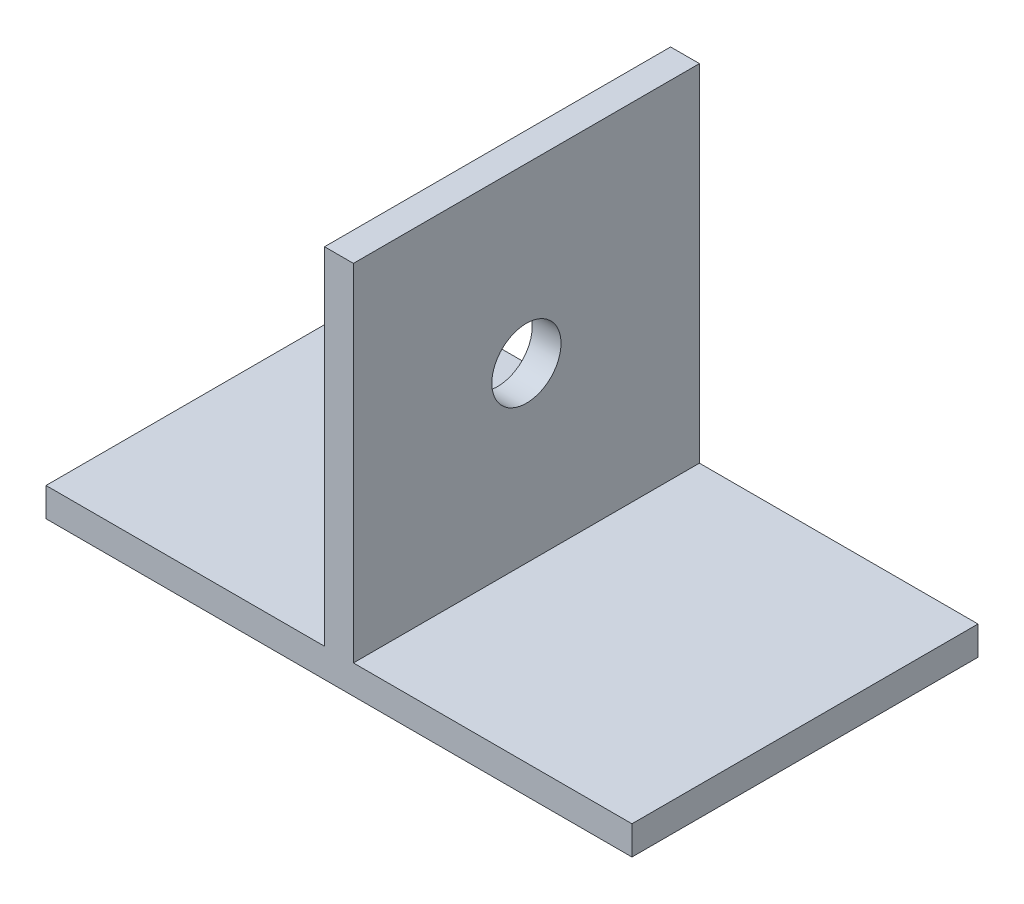
ISO-10303-21;
HEADER;
FILE_DESCRIPTION(('STEP AP214'),'2;1');
FILE_NAME('part.step','',(''),(''),'','','');
FILE_SCHEMA(('AUTOMOTIVE_DESIGN { 1 0 10303 214 1 1 1 1 }'));
ENDSEC;
DATA;
#1=APPLICATION_CONTEXT('core data for automotive mechanical design processes');
#2=APPLICATION_PROTOCOL_DEFINITION('international standard','automotive_design',2000,#1);
#3=PRODUCT_CONTEXT('',#1,'mechanical');
#4=PRODUCT('Part','Part','',(#3));
#5=PRODUCT_RELATED_PRODUCT_CATEGORY('part','',(#4));
#6=PRODUCT_DEFINITION_FORMATION('','',#4);
#7=PRODUCT_DEFINITION_CONTEXT('part definition',#1,'design');
#8=PRODUCT_DEFINITION('design','',#6,#7);
#9=PRODUCT_DEFINITION_SHAPE('','',#8);
#10=(LENGTH_UNIT() NAMED_UNIT(*) SI_UNIT(.MILLI.,.METRE.));
#11=(NAMED_UNIT(*) PLANE_ANGLE_UNIT() SI_UNIT($,.RADIAN.));
#12=(NAMED_UNIT(*) SI_UNIT($,.STERADIAN.) SOLID_ANGLE_UNIT());
#13=UNCERTAINTY_MEASURE_WITH_UNIT(LENGTH_MEASURE(1.E-05),#10,'distance_accuracy_value','');
#14=(GEOMETRIC_REPRESENTATION_CONTEXT(3) GLOBAL_UNCERTAINTY_ASSIGNED_CONTEXT((#13)) GLOBAL_UNIT_ASSIGNED_CONTEXT((#10,
#11,#12)) REPRESENTATION_CONTEXT('',''));
#15=CARTESIAN_POINT('',(0.,0.,0.));
#16=DIRECTION('',(0.,0.,1.));
#17=DIRECTION('',(1.,0.,0.));
#18=AXIS2_PLACEMENT_3D('',#15,#16,#17);
#19=CARTESIAN_POINT('',(1.25,2.49999999999999,30.));
#20=DIRECTION('',(-1.,0.,0.));
#21=DIRECTION('',(0.,-1.,0.));
#22=AXIS2_PLACEMENT_3D('',#19,#20,#21);
#23=PLANE('',#22);
#24=CARTESIAN_POINT('',(1.25,17.5,15.));
#25=DIRECTION('',(1.,0.,0.));
#26=DIRECTION('',(0.,1.,0.));
#27=AXIS2_PLACEMENT_3D('',#24,#25,#26);
#28=CIRCLE('',#27,3.);
#29=CARTESIAN_POINT('',(1.25,20.5,15.));
#30=VERTEX_POINT('',#29);
#31=EDGE_CURVE('E178',#30,#30,#28,.T.);
#32=ORIENTED_EDGE('',*,*,#31,.F.);
#33=EDGE_LOOP('',(#32));
#34=FACE_BOUND('',#33,.T.);
#35=DIRECTION('',(0.,1.,0.));
#36=VECTOR('',#35,1.);
#37=CARTESIAN_POINT('',(1.25,2.49999999999999,0.));
#38=LINE('',#37,#36);
#39=CARTESIAN_POINT('',(1.25,2.49999999999999,0.));
#40=VERTEX_POINT('',#39);
#41=CARTESIAN_POINT('',(1.25,32.5,0.));
#42=VERTEX_POINT('',#41);
#43=EDGE_CURVE('E130',#40,#42,#38,.T.);
#44=ORIENTED_EDGE('',*,*,#43,.T.);
#45=DIRECTION('',(0.,0.,-1.));
#46=VECTOR('',#45,1.);
#47=CARTESIAN_POINT('',(1.25,32.5,30.));
#48=LINE('',#47,#46);
#49=CARTESIAN_POINT('',(1.25,32.5,30.));
#50=VERTEX_POINT('',#49);
#51=EDGE_CURVE('E11',#50,#42,#48,.T.);
#52=ORIENTED_EDGE('',*,*,#51,.F.);
#53=DIRECTION('',(0.,1.,0.));
#54=VECTOR('',#53,1.);
#55=CARTESIAN_POINT('',(1.25,2.49999999999999,30.));
#56=LINE('',#55,#54);
#57=CARTESIAN_POINT('',(1.25,2.49999999999999,30.));
#58=VERTEX_POINT('',#57);
#59=EDGE_CURVE('E144',#58,#50,#56,.T.);
#60=ORIENTED_EDGE('',*,*,#59,.F.);
#61=DIRECTION('',(0.,0.,-1.));
#62=VECTOR('',#61,1.);
#63=CARTESIAN_POINT('',(1.25,2.49999999999999,30.));
#64=LINE('',#63,#62);
#65=EDGE_CURVE('E126',#58,#40,#64,.T.);
#66=ORIENTED_EDGE('',*,*,#65,.T.);
#67=EDGE_LOOP('',(#44,#52,#60,#66));
#68=FACE_BOUND('',#67,.T.);
#69=ADVANCED_FACE('F33',(#34,#68),#23,.F.);
#70=CARTESIAN_POINT('',(-1.25,32.5,30.));
#71=DIRECTION('',(0.,-1.,0.));
#72=DIRECTION('',(0.,0.,-1.));
#73=AXIS2_PLACEMENT_3D('',#70,#71,#72);
#74=PLANE('',#73);
#75=DIRECTION('',(-1.,0.,0.));
#76=VECTOR('',#75,1.);
#77=CARTESIAN_POINT('',(-1.25,32.5,0.));
#78=LINE('',#77,#76);
#79=CARTESIAN_POINT('',(-1.25,32.5,0.));
#80=VERTEX_POINT('',#79);
#81=EDGE_CURVE('E133',#42,#80,#78,.T.);
#82=ORIENTED_EDGE('',*,*,#81,.T.);
#83=DIRECTION('',(0.,0.,-1.));
#84=VECTOR('',#83,1.);
#85=CARTESIAN_POINT('',(-1.25,32.5,30.));
#86=LINE('',#85,#84);
#87=CARTESIAN_POINT('',(-1.25,32.5,30.));
#88=VERTEX_POINT('',#87);
#89=EDGE_CURVE('E42',#88,#80,#86,.T.);
#90=ORIENTED_EDGE('',*,*,#89,.F.);
#91=DIRECTION('',(-1.,0.,0.));
#92=VECTOR('',#91,1.);
#93=CARTESIAN_POINT('',(-1.25,32.5,30.));
#94=LINE('',#93,#92);
#95=EDGE_CURVE('E93',#50,#88,#94,.T.);
#96=ORIENTED_EDGE('',*,*,#95,.F.);
#97=ORIENTED_EDGE('',*,*,#51,.T.);
#98=EDGE_LOOP('',(#82,#90,#96,#97));
#99=FACE_BOUND('',#98,.T.);
#100=ADVANCED_FACE('F195',(#99),#74,.F.);
#101=CARTESIAN_POINT('',(-1.25,2.49999999999999,30.));
#102=DIRECTION('',(1.,0.,0.));
#103=DIRECTION('',(0.,1.,0.));
#104=AXIS2_PLACEMENT_3D('',#101,#102,#103);
#105=PLANE('',#104);
#106=CARTESIAN_POINT('',(-1.25,17.5,15.));
#107=DIRECTION('',(1.,0.,0.));
#108=DIRECTION('',(0.,1.,0.));
#109=AXIS2_PLACEMENT_3D('',#106,#107,#108);
#110=CIRCLE('',#109,3.);
#111=CARTESIAN_POINT('',(-1.25,20.5,15.));
#112=VERTEX_POINT('',#111);
#113=EDGE_CURVE('E36',#112,#112,#110,.T.);
#114=ORIENTED_EDGE('',*,*,#113,.T.);
#115=EDGE_LOOP('',(#114));
#116=FACE_BOUND('',#115,.T.);
#117=DIRECTION('',(0.,-1.,0.));
#118=VECTOR('',#117,1.);
#119=CARTESIAN_POINT('',(-1.25,2.49999999999999,0.));
#120=LINE('',#119,#118);
#121=CARTESIAN_POINT('',(-1.25,2.49999999999999,0.));
#122=VERTEX_POINT('',#121);
#123=EDGE_CURVE('E135',#80,#122,#120,.T.);
#124=ORIENTED_EDGE('',*,*,#123,.T.);
#125=DIRECTION('',(0.,0.,-1.));
#126=VECTOR('',#125,1.);
#127=CARTESIAN_POINT('',(-1.25,2.49999999999999,30.));
#128=LINE('',#127,#126);
#129=CARTESIAN_POINT('',(-1.25,2.49999999999999,30.));
#130=VERTEX_POINT('',#129);
#131=EDGE_CURVE('E151',#130,#122,#128,.T.);
#132=ORIENTED_EDGE('',*,*,#131,.F.);
#133=DIRECTION('',(0.,-1.,0.));
#134=VECTOR('',#133,1.);
#135=CARTESIAN_POINT('',(-1.25,2.49999999999999,30.));
#136=LINE('',#135,#134);
#137=EDGE_CURVE('E160',#88,#130,#136,.T.);
#138=ORIENTED_EDGE('',*,*,#137,.F.);
#139=ORIENTED_EDGE('',*,*,#89,.T.);
#140=EDGE_LOOP('',(#124,#132,#138,#139));
#141=FACE_BOUND('',#140,.T.);
#142=ADVANCED_FACE('F158',(#116,#141),#105,.F.);
#143=CARTESIAN_POINT('',(-25.4,2.49999999999999,30.));
#144=DIRECTION('',(0.,-1.,0.));
#145=DIRECTION('',(1.,0.,0.));
#146=AXIS2_PLACEMENT_3D('',#143,#144,#145);
#147=PLANE('',#146);
#148=DIRECTION('',(-1.,0.,0.));
#149=VECTOR('',#148,1.);
#150=CARTESIAN_POINT('',(-25.4,2.49999999999999,0.));
#151=LINE('',#150,#149);
#152=CARTESIAN_POINT('',(-25.4,2.49999999999999,0.));
#153=VERTEX_POINT('',#152);
#154=EDGE_CURVE('E137',#122,#153,#151,.T.);
#155=ORIENTED_EDGE('',*,*,#154,.T.);
#156=DIRECTION('',(0.,0.,-1.));
#157=VECTOR('',#156,1.);
#158=CARTESIAN_POINT('',(-25.4,2.49999999999999,30.));
#159=LINE('',#158,#157);
#160=CARTESIAN_POINT('',(-25.4,2.49999999999999,30.));
#161=VERTEX_POINT('',#160);
#162=EDGE_CURVE('E148',#161,#153,#159,.T.);
#163=ORIENTED_EDGE('',*,*,#162,.F.);
#164=DIRECTION('',(-1.,0.,0.));
#165=VECTOR('',#164,1.);
#166=CARTESIAN_POINT('',(-25.4,2.49999999999999,30.));
#167=LINE('',#166,#165);
#168=EDGE_CURVE('E172',#130,#161,#167,.T.);
#169=ORIENTED_EDGE('',*,*,#168,.F.);
#170=ORIENTED_EDGE('',*,*,#131,.T.);
#171=EDGE_LOOP('',(#155,#163,#169,#170));
#172=FACE_BOUND('',#171,.T.);
#173=ADVANCED_FACE('F168',(#172),#147,.F.);
#174=CARTESIAN_POINT('',(-25.4,0.,30.));
#175=DIRECTION('',(1.,0.,0.));
#176=DIRECTION('',(0.,0.,-1.));
#177=AXIS2_PLACEMENT_3D('',#174,#175,#176);
#178=PLANE('',#177);
#179=DIRECTION('',(0.,-1.,0.));
#180=VECTOR('',#179,1.);
#181=CARTESIAN_POINT('',(-25.4,0.,0.));
#182=LINE('',#181,#180);
#183=CARTESIAN_POINT('',(-25.4,0.,0.));
#184=VERTEX_POINT('',#183);
#185=EDGE_CURVE('E139',#153,#184,#182,.T.);
#186=ORIENTED_EDGE('',*,*,#185,.T.);
#187=DIRECTION('',(0.,0.,-1.));
#188=VECTOR('',#187,1.);
#189=CARTESIAN_POINT('',(-25.4,0.,30.));
#190=LINE('',#189,#188);
#191=CARTESIAN_POINT('',(-25.4,0.,30.));
#192=VERTEX_POINT('',#191);
#193=EDGE_CURVE('E121',#192,#184,#190,.T.);
#194=ORIENTED_EDGE('',*,*,#193,.F.);
#195=DIRECTION('',(0.,-1.,0.));
#196=VECTOR('',#195,1.);
#197=CARTESIAN_POINT('',(-25.4,0.,30.));
#198=LINE('',#197,#196);
#199=EDGE_CURVE('E112',#161,#192,#198,.T.);
#200=ORIENTED_EDGE('',*,*,#199,.F.);
#201=ORIENTED_EDGE('',*,*,#162,.T.);
#202=EDGE_LOOP('',(#186,#194,#200,#201));
#203=FACE_BOUND('',#202,.T.);
#204=ADVANCED_FACE('F171',(#203),#178,.F.);
#205=CARTESIAN_POINT('',(25.4,0.,30.));
#206=DIRECTION('',(0.,1.,0.));
#207=DIRECTION('',(-1.,0.,0.));
#208=AXIS2_PLACEMENT_3D('',#205,#206,#207);
#209=PLANE('',#208);
#210=DIRECTION('',(1.,0.,0.));
#211=VECTOR('',#210,1.);
#212=CARTESIAN_POINT('',(25.4,0.,0.));
#213=LINE('',#212,#211);
#214=CARTESIAN_POINT('',(25.4,0.,0.));
#215=VERTEX_POINT('',#214);
#216=EDGE_CURVE('E120',#184,#215,#213,.T.);
#217=ORIENTED_EDGE('',*,*,#216,.T.);
#218=DIRECTION('',(0.,0.,-1.));
#219=VECTOR('',#218,1.);
#220=CARTESIAN_POINT('',(25.4,0.,30.));
#221=LINE('',#220,#219);
#222=CARTESIAN_POINT('',(25.4,0.,30.));
#223=VERTEX_POINT('',#222);
#224=EDGE_CURVE('E117',#223,#215,#221,.T.);
#225=ORIENTED_EDGE('',*,*,#224,.F.);
#226=DIRECTION('',(1.,0.,0.));
#227=VECTOR('',#226,1.);
#228=CARTESIAN_POINT('',(25.4,0.,30.));
#229=LINE('',#228,#227);
#230=EDGE_CURVE('E106',#192,#223,#229,.T.);
#231=ORIENTED_EDGE('',*,*,#230,.F.);
#232=ORIENTED_EDGE('',*,*,#193,.T.);
#233=EDGE_LOOP('',(#217,#225,#231,#232));
#234=FACE_BOUND('',#233,.T.);
#235=ADVANCED_FACE('F118',(#234),#209,.F.);
#236=CARTESIAN_POINT('',(25.4,0.,30.));
#237=DIRECTION('',(-1.,0.,0.));
#238=DIRECTION('',(0.,0.,1.));
#239=AXIS2_PLACEMENT_3D('',#236,#237,#238);
#240=PLANE('',#239);
#241=DIRECTION('',(0.,1.,0.));
#242=VECTOR('',#241,1.);
#243=CARTESIAN_POINT('',(25.4,0.,0.));
#244=LINE('',#243,#242);
#245=CARTESIAN_POINT('',(25.4,2.5,0.));
#246=VERTEX_POINT('',#245);
#247=EDGE_CURVE('E79',#215,#246,#244,.T.);
#248=ORIENTED_EDGE('',*,*,#247,.T.);
#249=DIRECTION('',(0.,0.,-1.));
#250=VECTOR('',#249,1.);
#251=CARTESIAN_POINT('',(25.4,2.5,30.));
#252=LINE('',#251,#250);
#253=CARTESIAN_POINT('',(25.4,2.5,30.));
#254=VERTEX_POINT('',#253);
#255=EDGE_CURVE('E122',#254,#246,#252,.T.);
#256=ORIENTED_EDGE('',*,*,#255,.F.);
#257=DIRECTION('',(0.,1.,0.));
#258=VECTOR('',#257,1.);
#259=CARTESIAN_POINT('',(25.4,0.,30.));
#260=LINE('',#259,#258);
#261=EDGE_CURVE('E110',#223,#254,#260,.T.);
#262=ORIENTED_EDGE('',*,*,#261,.F.);
#263=ORIENTED_EDGE('',*,*,#224,.T.);
#264=EDGE_LOOP('',(#248,#256,#262,#263));
#265=FACE_BOUND('',#264,.T.);
#266=ADVANCED_FACE('F124',(#265),#240,.F.);
#267=CARTESIAN_POINT('',(25.4,2.5,30.));
#268=DIRECTION('',(0.,-1.,0.));
#269=DIRECTION('',(1.,0.,0.));
#270=AXIS2_PLACEMENT_3D('',#267,#268,#269);
#271=PLANE('',#270);
#272=DIRECTION('',(-1.,0.,0.));
#273=VECTOR('',#272,1.);
#274=CARTESIAN_POINT('',(25.4,2.5,0.));
#275=LINE('',#274,#273);
#276=EDGE_CURVE('E85',#246,#40,#275,.T.);
#277=ORIENTED_EDGE('',*,*,#276,.T.);
#278=ORIENTED_EDGE('',*,*,#65,.F.);
#279=DIRECTION('',(-1.,0.,0.));
#280=VECTOR('',#279,1.);
#281=CARTESIAN_POINT('',(25.4,2.5,30.));
#282=LINE('',#281,#280);
#283=EDGE_CURVE('E50',#254,#58,#282,.T.);
#284=ORIENTED_EDGE('',*,*,#283,.F.);
#285=ORIENTED_EDGE('',*,*,#255,.T.);
#286=EDGE_LOOP('',(#277,#278,#284,#285));
#287=FACE_BOUND('',#286,.T.);
#288=ADVANCED_FACE('F203',(#287),#271,.F.);
#289=CARTESIAN_POINT('',(0.,0.,30.));
#290=DIRECTION('',(0.,0.,-1.));
#291=DIRECTION('',(-1.,0.,0.));
#292=AXIS2_PLACEMENT_3D('',#289,#290,#291);
#293=PLANE('',#292);
#294=ORIENTED_EDGE('',*,*,#59,.T.);
#295=ORIENTED_EDGE('',*,*,#95,.T.);
#296=ORIENTED_EDGE('',*,*,#137,.T.);
#297=ORIENTED_EDGE('',*,*,#168,.T.);
#298=ORIENTED_EDGE('',*,*,#199,.T.);
#299=ORIENTED_EDGE('',*,*,#230,.T.);
#300=ORIENTED_EDGE('',*,*,#261,.T.);
#301=ORIENTED_EDGE('',*,*,#283,.T.);
#302=EDGE_LOOP('',(#294,#295,#296,#297,#298,#299,#300,#301));
#303=FACE_BOUND('',#302,.T.);
#304=ADVANCED_FACE('F108',(#303),#293,.F.);
#305=CARTESIAN_POINT('',(0.,0.,0.));
#306=DIRECTION('',(0.,0.,-1.));
#307=DIRECTION('',(-1.,0.,0.));
#308=AXIS2_PLACEMENT_3D('',#305,#306,#307);
#309=PLANE('',#308);
#310=ORIENTED_EDGE('',*,*,#43,.F.);
#311=ORIENTED_EDGE('',*,*,#276,.F.);
#312=ORIENTED_EDGE('',*,*,#247,.F.);
#313=ORIENTED_EDGE('',*,*,#216,.F.);
#314=ORIENTED_EDGE('',*,*,#185,.F.);
#315=ORIENTED_EDGE('',*,*,#154,.F.);
#316=ORIENTED_EDGE('',*,*,#123,.F.);
#317=ORIENTED_EDGE('',*,*,#81,.F.);
#318=EDGE_LOOP('',(#310,#311,#312,#313,#314,#315,#316,#317));
#319=FACE_BOUND('',#318,.T.);
#320=ADVANCED_FACE('F164',(#319),#309,.T.);
#321=CARTESIAN_POINT('',(-49.55,17.5,15.));
#322=DIRECTION('',(1.,0.,0.));
#323=DIRECTION('',(0.,1.,0.));
#324=AXIS2_PLACEMENT_3D('',#321,#322,#323);
#325=CYLINDRICAL_SURFACE('',#324,3.);
#326=ORIENTED_EDGE('',*,*,#31,.T.);
#327=EDGE_LOOP('',(#326));
#328=FACE_BOUND('',#327,.T.);
#329=ORIENTED_EDGE('',*,*,#113,.F.);
#330=EDGE_LOOP('',(#329));
#331=FACE_BOUND('',#330,.T.);
#332=ADVANCED_FACE('F186',(#328,#331),#325,.F.);
#333=CLOSED_SHELL('',(#69,#100,#142,#173,#204,#235,#266,#288,#304,#320,#332));
#334=MANIFOLD_SOLID_BREP('B2',#333);
#335=ADVANCED_BREP_SHAPE_REPRESENTATION('',(#18,#334),#14);
#336=SHAPE_DEFINITION_REPRESENTATION(#9,#335);
ENDSEC;
END-ISO-10303-21;
